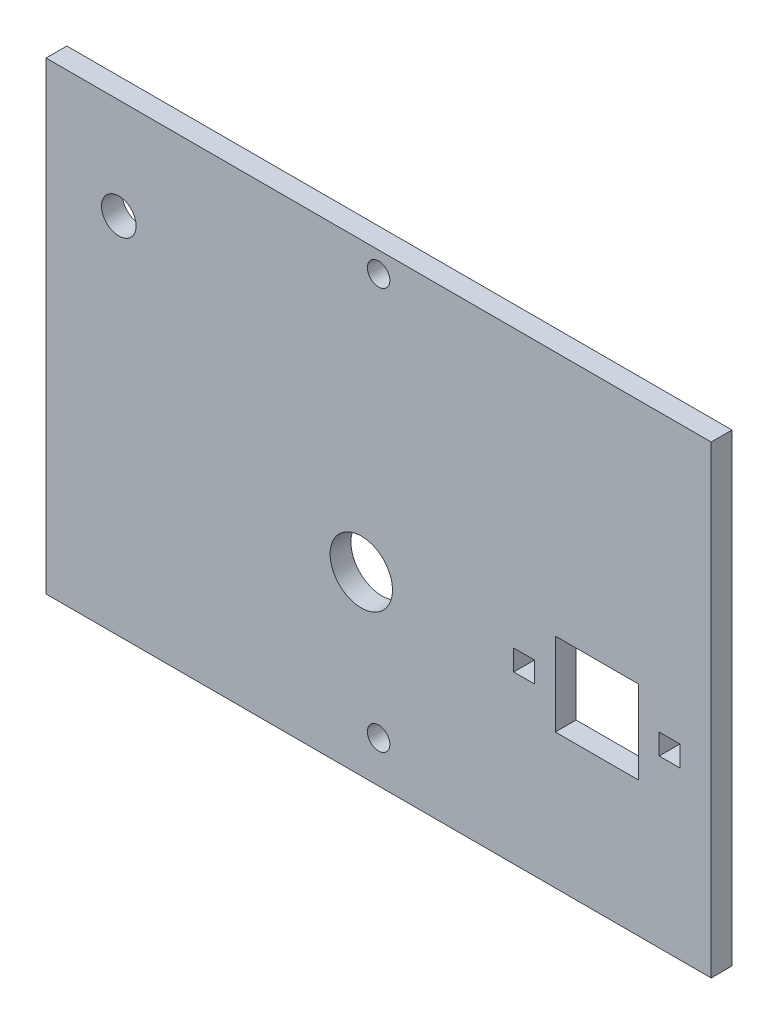
ISO-10303-21;
HEADER;
FILE_DESCRIPTION(('STEP AP214'),'2;1');
FILE_NAME('part.step','',(''),(''),'','','');
FILE_SCHEMA(('AUTOMOTIVE_DESIGN { 1 0 10303 214 1 1 1 1 }'));
ENDSEC;
DATA;
#1=APPLICATION_CONTEXT('core data for automotive mechanical design processes');
#2=APPLICATION_PROTOCOL_DEFINITION('international standard','automotive_design',2000,#1);
#3=PRODUCT_CONTEXT('',#1,'mechanical');
#4=PRODUCT('Part','Part','',(#3));
#5=PRODUCT_RELATED_PRODUCT_CATEGORY('part','',(#4));
#6=PRODUCT_DEFINITION_FORMATION('','',#4);
#7=PRODUCT_DEFINITION_CONTEXT('part definition',#1,'design');
#8=PRODUCT_DEFINITION('design','',#6,#7);
#9=PRODUCT_DEFINITION_SHAPE('','',#8);
#10=(LENGTH_UNIT() NAMED_UNIT(*) SI_UNIT(.MILLI.,.METRE.));
#11=(NAMED_UNIT(*) PLANE_ANGLE_UNIT() SI_UNIT($,.RADIAN.));
#12=(NAMED_UNIT(*) SI_UNIT($,.STERADIAN.) SOLID_ANGLE_UNIT());
#13=UNCERTAINTY_MEASURE_WITH_UNIT(LENGTH_MEASURE(1.E-05),#10,'distance_accuracy_value','');
#14=(GEOMETRIC_REPRESENTATION_CONTEXT(3) GLOBAL_UNCERTAINTY_ASSIGNED_CONTEXT((#13)) GLOBAL_UNIT_ASSIGNED_CONTEXT((#10,
#11,#12)) REPRESENTATION_CONTEXT('',''));
#15=CARTESIAN_POINT('',(0.,0.,0.));
#16=DIRECTION('',(0.,0.,1.));
#17=DIRECTION('',(1.,0.,0.));
#18=AXIS2_PLACEMENT_3D('',#15,#16,#17);
#19=CARTESIAN_POINT('',(48.,-33.5,3.));
#20=DIRECTION('',(-1.,0.,0.));
#21=DIRECTION('',(0.,0.,1.));
#22=AXIS2_PLACEMENT_3D('',#19,#20,#21);
#23=PLANE('',#22);
#24=DIRECTION('',(0.,1.,0.));
#25=VECTOR('',#24,1.);
#26=CARTESIAN_POINT('',(48.,-33.5,0.));
#27=LINE('',#26,#25);
#28=CARTESIAN_POINT('',(48.,-33.5,0.));
#29=VERTEX_POINT('',#28);
#30=CARTESIAN_POINT('',(48.,33.5,0.));
#31=VERTEX_POINT('',#30);
#32=EDGE_CURVE('E324',#29,#31,#27,.T.);
#33=ORIENTED_EDGE('',*,*,#32,.T.);
#34=DIRECTION('',(0.,0.,-1.));
#35=VECTOR('',#34,1.);
#36=CARTESIAN_POINT('',(48.,33.5,3.));
#37=LINE('',#36,#35);
#38=CARTESIAN_POINT('',(48.,33.5,3.));
#39=VERTEX_POINT('',#38);
#40=EDGE_CURVE('E11',#39,#31,#37,.T.);
#41=ORIENTED_EDGE('',*,*,#40,.F.);
#42=DIRECTION('',(0.,1.,0.));
#43=VECTOR('',#42,1.);
#44=CARTESIAN_POINT('',(48.,-33.5,3.));
#45=LINE('',#44,#43);
#46=CARTESIAN_POINT('',(48.,-33.5,3.));
#47=VERTEX_POINT('',#46);
#48=EDGE_CURVE('E309',#47,#39,#45,.T.);
#49=ORIENTED_EDGE('',*,*,#48,.F.);
#50=DIRECTION('',(0.,0.,-1.));
#51=VECTOR('',#50,1.);
#52=CARTESIAN_POINT('',(48.,-33.5,3.));
#53=LINE('',#52,#51);
#54=EDGE_CURVE('E323',#47,#29,#53,.T.);
#55=ORIENTED_EDGE('',*,*,#54,.T.);
#56=EDGE_LOOP('',(#33,#41,#49,#55));
#57=FACE_BOUND('',#56,.T.);
#58=ADVANCED_FACE('F43',(#57),#23,.F.);
#59=CARTESIAN_POINT('',(-48.,33.5,3.));
#60=DIRECTION('',(0.,-1.,0.));
#61=DIRECTION('',(0.,0.,-1.));
#62=AXIS2_PLACEMENT_3D('',#59,#60,#61);
#63=PLANE('',#62);
#64=DIRECTION('',(-1.,0.,0.));
#65=VECTOR('',#64,1.);
#66=CARTESIAN_POINT('',(-48.,33.5,0.));
#67=LINE('',#66,#65);
#68=CARTESIAN_POINT('',(-48.,33.5,0.));
#69=VERTEX_POINT('',#68);
#70=EDGE_CURVE('E328',#31,#69,#67,.T.);
#71=ORIENTED_EDGE('',*,*,#70,.T.);
#72=DIRECTION('',(0.,0.,-1.));
#73=VECTOR('',#72,1.);
#74=CARTESIAN_POINT('',(-48.,33.5,3.));
#75=LINE('',#74,#73);
#76=CARTESIAN_POINT('',(-48.,33.5,3.));
#77=VERTEX_POINT('',#76);
#78=EDGE_CURVE('E51',#77,#69,#75,.T.);
#79=ORIENTED_EDGE('',*,*,#78,.F.);
#80=DIRECTION('',(-1.,0.,0.));
#81=VECTOR('',#80,1.);
#82=CARTESIAN_POINT('',(-48.,33.5,3.));
#83=LINE('',#82,#81);
#84=EDGE_CURVE('E313',#39,#77,#83,.T.);
#85=ORIENTED_EDGE('',*,*,#84,.F.);
#86=ORIENTED_EDGE('',*,*,#40,.T.);
#87=EDGE_LOOP('',(#71,#79,#85,#86));
#88=FACE_BOUND('',#87,.T.);
#89=ADVANCED_FACE('F364',(#88),#63,.F.);
#90=CARTESIAN_POINT('',(-48.,-33.5,3.));
#91=DIRECTION('',(1.,0.,0.));
#92=DIRECTION('',(0.,0.,-1.));
#93=AXIS2_PLACEMENT_3D('',#90,#91,#92);
#94=PLANE('',#93);
#95=DIRECTION('',(0.,-1.,0.));
#96=VECTOR('',#95,1.);
#97=CARTESIAN_POINT('',(-48.,-33.5,0.));
#98=LINE('',#97,#96);
#99=CARTESIAN_POINT('',(-48.,-33.5,0.));
#100=VERTEX_POINT('',#99);
#101=EDGE_CURVE('E332',#69,#100,#98,.T.);
#102=ORIENTED_EDGE('',*,*,#101,.T.);
#103=DIRECTION('',(0.,0.,-1.));
#104=VECTOR('',#103,1.);
#105=CARTESIAN_POINT('',(-48.,-33.5,3.));
#106=LINE('',#105,#104);
#107=CARTESIAN_POINT('',(-48.,-33.5,3.));
#108=VERTEX_POINT('',#107);
#109=EDGE_CURVE('E340',#108,#100,#106,.T.);
#110=ORIENTED_EDGE('',*,*,#109,.F.);
#111=DIRECTION('',(0.,-1.,0.));
#112=VECTOR('',#111,1.);
#113=CARTESIAN_POINT('',(-48.,-33.5,3.));
#114=LINE('',#113,#112);
#115=EDGE_CURVE('E317',#77,#108,#114,.T.);
#116=ORIENTED_EDGE('',*,*,#115,.F.);
#117=ORIENTED_EDGE('',*,*,#78,.T.);
#118=EDGE_LOOP('',(#102,#110,#116,#117));
#119=FACE_BOUND('',#118,.T.);
#120=ADVANCED_FACE('F349',(#119),#94,.F.);
#121=CARTESIAN_POINT('',(-48.,-33.5,3.));
#122=DIRECTION('',(0.,1.,0.));
#123=DIRECTION('',(0.,0.,1.));
#124=AXIS2_PLACEMENT_3D('',#121,#122,#123);
#125=PLANE('',#124);
#126=DIRECTION('',(1.,0.,0.));
#127=VECTOR('',#126,1.);
#128=CARTESIAN_POINT('',(-48.,-33.5,0.));
#129=LINE('',#128,#127);
#130=EDGE_CURVE('E314',#100,#29,#129,.T.);
#131=ORIENTED_EDGE('',*,*,#130,.T.);
#132=ORIENTED_EDGE('',*,*,#54,.F.);
#133=DIRECTION('',(1.,0.,0.));
#134=VECTOR('',#133,1.);
#135=CARTESIAN_POINT('',(-48.,-33.5,3.));
#136=LINE('',#135,#134);
#137=EDGE_CURVE('E320',#108,#47,#136,.T.);
#138=ORIENTED_EDGE('',*,*,#137,.F.);
#139=ORIENTED_EDGE('',*,*,#109,.T.);
#140=EDGE_LOOP('',(#131,#132,#138,#139));
#141=FACE_BOUND('',#140,.T.);
#142=ADVANCED_FACE('F357',(#141),#125,.F.);
#143=CARTESIAN_POINT('',(0.,0.,3.));
#144=DIRECTION('',(0.,0.,-1.));
#145=DIRECTION('',(-1.,0.,0.));
#146=AXIS2_PLACEMENT_3D('',#143,#144,#145);
#147=PLANE('',#146);
#148=CARTESIAN_POINT('',(-37.5,19.,3.));
#149=DIRECTION('',(0.,0.,1.));
#150=DIRECTION('',(1.,0.,0.));
#151=AXIS2_PLACEMENT_3D('',#148,#149,#150);
#152=CIRCLE('',#151,2.5);
#153=CARTESIAN_POINT('',(-35.,19.,3.));
#154=VERTEX_POINT('',#153);
#155=EDGE_CURVE('E329',#154,#154,#152,.T.);
#156=ORIENTED_EDGE('',*,*,#155,.F.);
#157=EDGE_LOOP('',(#156));
#158=FACE_BOUND('',#157,.T.);
#159=DIRECTION('',(0.,1.,0.));
#160=VECTOR('',#159,1.);
#161=CARTESIAN_POINT('',(43.5,-9.50000000000001,3.));
#162=LINE('',#161,#160);
#163=CARTESIAN_POINT('',(43.5,-9.50000000000001,3.));
#164=VERTEX_POINT('',#163);
#165=CARTESIAN_POINT('',(43.5,-6.50000000000001,3.));
#166=VERTEX_POINT('',#165);
#167=EDGE_CURVE('E219',#164,#166,#162,.T.);
#168=ORIENTED_EDGE('',*,*,#167,.F.);
#169=DIRECTION('',(1.,0.,0.));
#170=VECTOR('',#169,1.);
#171=CARTESIAN_POINT('',(40.5,-9.50000000000001,3.));
#172=LINE('',#171,#170);
#173=CARTESIAN_POINT('',(40.5,-9.50000000000001,3.));
#174=VERTEX_POINT('',#173);
#175=EDGE_CURVE('E213',#174,#164,#172,.T.);
#176=ORIENTED_EDGE('',*,*,#175,.F.);
#177=DIRECTION('',(0.,-1.,0.));
#178=VECTOR('',#177,1.);
#179=CARTESIAN_POINT('',(40.5,-9.50000000000001,3.));
#180=LINE('',#179,#178);
#181=CARTESIAN_POINT('',(40.5,-6.50000000000001,3.));
#182=VERTEX_POINT('',#181);
#183=EDGE_CURVE('E234',#182,#174,#180,.T.);
#184=ORIENTED_EDGE('',*,*,#183,.F.);
#185=DIRECTION('',(-1.,0.,0.));
#186=VECTOR('',#185,1.);
#187=CARTESIAN_POINT('',(40.5,-6.50000000000001,3.));
#188=LINE('',#187,#186);
#189=EDGE_CURVE('E237',#166,#182,#188,.T.);
#190=ORIENTED_EDGE('',*,*,#189,.F.);
#191=EDGE_LOOP('',(#168,#176,#184,#190));
#192=FACE_BOUND('',#191,.T.);
#193=DIRECTION('',(0.,1.,0.));
#194=VECTOR('',#193,1.);
#195=CARTESIAN_POINT('',(22.5,-9.50000000000001,3.));
#196=LINE('',#195,#194);
#197=CARTESIAN_POINT('',(22.5,-9.50000000000001,3.));
#198=VERTEX_POINT('',#197);
#199=CARTESIAN_POINT('',(22.5,-6.50000000000001,3.));
#200=VERTEX_POINT('',#199);
#201=EDGE_CURVE('E175',#198,#200,#196,.T.);
#202=ORIENTED_EDGE('',*,*,#201,.F.);
#203=DIRECTION('',(1.,0.,0.));
#204=VECTOR('',#203,1.);
#205=CARTESIAN_POINT('',(19.5,-9.50000000000001,3.));
#206=LINE('',#205,#204);
#207=CARTESIAN_POINT('',(19.5,-9.50000000000001,3.));
#208=VERTEX_POINT('',#207);
#209=EDGE_CURVE('E190',#208,#198,#206,.T.);
#210=ORIENTED_EDGE('',*,*,#209,.F.);
#211=DIRECTION('',(0.,-1.,0.));
#212=VECTOR('',#211,1.);
#213=CARTESIAN_POINT('',(19.5,-9.50000000000001,3.));
#214=LINE('',#213,#212);
#215=CARTESIAN_POINT('',(19.5,-6.50000000000001,3.));
#216=VERTEX_POINT('',#215);
#217=EDGE_CURVE('E161',#216,#208,#214,.T.);
#218=ORIENTED_EDGE('',*,*,#217,.F.);
#219=DIRECTION('',(-1.,0.,0.));
#220=VECTOR('',#219,1.);
#221=CARTESIAN_POINT('',(19.5,-6.50000000000001,3.));
#222=LINE('',#221,#220);
#223=EDGE_CURVE('E195',#200,#216,#222,.T.);
#224=ORIENTED_EDGE('',*,*,#223,.F.);
#225=EDGE_LOOP('',(#202,#210,#218,#224));
#226=FACE_BOUND('',#225,.T.);
#227=CARTESIAN_POINT('',(-2.50000000000002,-8.00000000000001,3.));
#228=DIRECTION('',(0.,0.,1.));
#229=DIRECTION('',(1.,0.,0.));
#230=AXIS2_PLACEMENT_3D('',#227,#228,#229);
#231=CIRCLE('',#230,4.5);
#232=CARTESIAN_POINT('',(1.99999999999998,-8.00000000000001,3.));
#233=VERTEX_POINT('',#232);
#234=EDGE_CURVE('E263',#233,#233,#231,.T.);
#235=ORIENTED_EDGE('',*,*,#234,.F.);
#236=EDGE_LOOP('',(#235));
#237=FACE_BOUND('',#236,.T.);
#238=DIRECTION('',(0.,1.,0.));
#239=VECTOR('',#238,1.);
#240=CARTESIAN_POINT('',(37.5,-2.00000000000001,3.));
#241=LINE('',#240,#239);
#242=CARTESIAN_POINT('',(37.5,-14.,3.));
#243=VERTEX_POINT('',#242);
#244=CARTESIAN_POINT('',(37.5,-2.00000000000001,3.));
#245=VERTEX_POINT('',#244);
#246=EDGE_CURVE('E287',#243,#245,#241,.T.);
#247=ORIENTED_EDGE('',*,*,#246,.F.);
#248=DIRECTION('',(1.,0.,0.));
#249=VECTOR('',#248,1.);
#250=CARTESIAN_POINT('',(25.5,-14.,3.));
#251=LINE('',#250,#249);
#252=CARTESIAN_POINT('',(25.5,-14.,3.));
#253=VERTEX_POINT('',#252);
#254=EDGE_CURVE('E281',#253,#243,#251,.T.);
#255=ORIENTED_EDGE('',*,*,#254,.F.);
#256=DIRECTION('',(0.,-1.,0.));
#257=VECTOR('',#256,1.);
#258=CARTESIAN_POINT('',(25.5,-2.00000000000001,3.));
#259=LINE('',#258,#257);
#260=CARTESIAN_POINT('',(25.5,-2.00000000000001,3.));
#261=VERTEX_POINT('',#260);
#262=EDGE_CURVE('E300',#261,#253,#259,.T.);
#263=ORIENTED_EDGE('',*,*,#262,.F.);
#264=DIRECTION('',(-1.,0.,0.));
#265=VECTOR('',#264,1.);
#266=CARTESIAN_POINT('',(25.5,-2.00000000000001,3.));
#267=LINE('',#266,#265);
#268=EDGE_CURVE('E304',#245,#261,#267,.T.);
#269=ORIENTED_EDGE('',*,*,#268,.F.);
#270=EDGE_LOOP('',(#247,#255,#263,#269));
#271=FACE_BOUND('',#270,.T.);
#272=CARTESIAN_POINT('',(0.,30.5,3.));
#273=DIRECTION('',(0.,0.,1.));
#274=DIRECTION('',(1.,0.,0.));
#275=AXIS2_PLACEMENT_3D('',#272,#273,#274);
#276=CIRCLE('',#275,1.625);
#277=CARTESIAN_POINT('',(1.62499999999996,30.5,3.));
#278=VERTEX_POINT('',#277);
#279=EDGE_CURVE('E247',#278,#278,#276,.T.);
#280=ORIENTED_EDGE('',*,*,#279,.F.);
#281=EDGE_LOOP('',(#280));
#282=FACE_BOUND('',#281,.T.);
#283=CARTESIAN_POINT('',(0.,-27.5000000000004,3.));
#284=DIRECTION('',(0.,0.,1.));
#285=DIRECTION('',(1.,0.,0.));
#286=AXIS2_PLACEMENT_3D('',#283,#284,#285);
#287=CIRCLE('',#286,1.625);
#288=CARTESIAN_POINT('',(1.625,-27.5000000000004,3.));
#289=VERTEX_POINT('',#288);
#290=EDGE_CURVE('E189',#289,#289,#287,.T.);
#291=ORIENTED_EDGE('',*,*,#290,.F.);
#292=EDGE_LOOP('',(#291));
#293=FACE_BOUND('',#292,.T.);
#294=ORIENTED_EDGE('',*,*,#48,.T.);
#295=ORIENTED_EDGE('',*,*,#84,.T.);
#296=ORIENTED_EDGE('',*,*,#115,.T.);
#297=ORIENTED_EDGE('',*,*,#137,.T.);
#298=EDGE_LOOP('',(#294,#295,#296,#297));
#299=FACE_BOUND('',#298,.T.);
#300=ADVANCED_FACE('F363',(#158,#192,#226,#237,#271,#282,#293,#299),#147,.F.);
#301=CARTESIAN_POINT('',(0.,0.,0.));
#302=DIRECTION('',(0.,0.,-1.));
#303=DIRECTION('',(-1.,0.,0.));
#304=AXIS2_PLACEMENT_3D('',#301,#302,#303);
#305=PLANE('',#304);
#306=CARTESIAN_POINT('',(-37.5,19.,0.));
#307=DIRECTION('',(0.,0.,1.));
#308=DIRECTION('',(1.,0.,0.));
#309=AXIS2_PLACEMENT_3D('',#306,#307,#308);
#310=CIRCLE('',#309,2.5);
#311=CARTESIAN_POINT('',(-35.,19.,0.));
#312=VERTEX_POINT('',#311);
#313=EDGE_CURVE('E262',#312,#312,#310,.T.);
#314=ORIENTED_EDGE('',*,*,#313,.T.);
#315=EDGE_LOOP('',(#314));
#316=FACE_BOUND('',#315,.T.);
#317=DIRECTION('',(1.,0.,0.));
#318=VECTOR('',#317,1.);
#319=CARTESIAN_POINT('',(40.5,-9.50000000000001,0.));
#320=LINE('',#319,#318);
#321=CARTESIAN_POINT('',(40.5,-9.50000000000001,0.));
#322=VERTEX_POINT('',#321);
#323=CARTESIAN_POINT('',(43.5,-9.50000000000001,0.));
#324=VERTEX_POINT('',#323);
#325=EDGE_CURVE('E214',#322,#324,#320,.T.);
#326=ORIENTED_EDGE('',*,*,#325,.T.);
#327=DIRECTION('',(0.,1.,0.));
#328=VECTOR('',#327,1.);
#329=CARTESIAN_POINT('',(43.5,-9.50000000000001,0.));
#330=LINE('',#329,#328);
#331=CARTESIAN_POINT('',(43.5,-6.50000000000001,0.));
#332=VERTEX_POINT('',#331);
#333=EDGE_CURVE('E227',#324,#332,#330,.T.);
#334=ORIENTED_EDGE('',*,*,#333,.T.);
#335=DIRECTION('',(-1.,0.,0.));
#336=VECTOR('',#335,1.);
#337=CARTESIAN_POINT('',(40.5,-6.50000000000001,0.));
#338=LINE('',#337,#336);
#339=CARTESIAN_POINT('',(40.5,-6.50000000000001,0.));
#340=VERTEX_POINT('',#339);
#341=EDGE_CURVE('E223',#332,#340,#338,.T.);
#342=ORIENTED_EDGE('',*,*,#341,.T.);
#343=DIRECTION('',(0.,-1.,0.));
#344=VECTOR('',#343,1.);
#345=CARTESIAN_POINT('',(40.5,-9.50000000000001,0.));
#346=LINE('',#345,#344);
#347=EDGE_CURVE('E218',#340,#322,#346,.T.);
#348=ORIENTED_EDGE('',*,*,#347,.T.);
#349=EDGE_LOOP('',(#326,#334,#342,#348));
#350=FACE_BOUND('',#349,.T.);
#351=DIRECTION('',(1.,0.,0.));
#352=VECTOR('',#351,1.);
#353=CARTESIAN_POINT('',(19.5,-9.50000000000001,0.));
#354=LINE('',#353,#352);
#355=CARTESIAN_POINT('',(19.5,-9.50000000000001,0.));
#356=VERTEX_POINT('',#355);
#357=CARTESIAN_POINT('',(22.5,-9.50000000000001,0.));
#358=VERTEX_POINT('',#357);
#359=EDGE_CURVE('E169',#356,#358,#354,.T.);
#360=ORIENTED_EDGE('',*,*,#359,.T.);
#361=DIRECTION('',(0.,1.,0.));
#362=VECTOR('',#361,1.);
#363=CARTESIAN_POINT('',(22.5,-9.50000000000001,0.));
#364=LINE('',#363,#362);
#365=CARTESIAN_POINT('',(22.5,-6.50000000000001,0.));
#366=VERTEX_POINT('',#365);
#367=EDGE_CURVE('E183',#358,#366,#364,.T.);
#368=ORIENTED_EDGE('',*,*,#367,.T.);
#369=DIRECTION('',(-1.,0.,0.));
#370=VECTOR('',#369,1.);
#371=CARTESIAN_POINT('',(19.5,-6.50000000000001,0.));
#372=LINE('',#371,#370);
#373=CARTESIAN_POINT('',(19.5,-6.50000000000001,0.));
#374=VERTEX_POINT('',#373);
#375=EDGE_CURVE('E179',#366,#374,#372,.T.);
#376=ORIENTED_EDGE('',*,*,#375,.T.);
#377=DIRECTION('',(0.,-1.,0.));
#378=VECTOR('',#377,1.);
#379=CARTESIAN_POINT('',(19.5,-9.50000000000001,0.));
#380=LINE('',#379,#378);
#381=EDGE_CURVE('E158',#374,#356,#380,.T.);
#382=ORIENTED_EDGE('',*,*,#381,.T.);
#383=EDGE_LOOP('',(#360,#368,#376,#382));
#384=FACE_BOUND('',#383,.T.);
#385=CARTESIAN_POINT('',(-2.50000000000002,-8.00000000000001,0.));
#386=DIRECTION('',(0.,0.,1.));
#387=DIRECTION('',(1.,0.,0.));
#388=AXIS2_PLACEMENT_3D('',#385,#386,#387);
#389=CIRCLE('',#388,4.5);
#390=CARTESIAN_POINT('',(1.99999999999998,-8.00000000000001,0.));
#391=VERTEX_POINT('',#390);
#392=EDGE_CURVE('E258',#391,#391,#389,.T.);
#393=ORIENTED_EDGE('',*,*,#392,.T.);
#394=EDGE_LOOP('',(#393));
#395=FACE_BOUND('',#394,.T.);
#396=DIRECTION('',(1.,0.,0.));
#397=VECTOR('',#396,1.);
#398=CARTESIAN_POINT('',(25.5,-14.,0.));
#399=LINE('',#398,#397);
#400=CARTESIAN_POINT('',(25.5,-14.,0.));
#401=VERTEX_POINT('',#400);
#402=CARTESIAN_POINT('',(37.5,-14.,0.));
#403=VERTEX_POINT('',#402);
#404=EDGE_CURVE('E282',#401,#403,#399,.T.);
#405=ORIENTED_EDGE('',*,*,#404,.T.);
#406=DIRECTION('',(0.,1.,0.));
#407=VECTOR('',#406,1.);
#408=CARTESIAN_POINT('',(37.5,-2.00000000000001,0.));
#409=LINE('',#408,#407);
#410=CARTESIAN_POINT('',(37.5,-2.00000000000001,0.));
#411=VERTEX_POINT('',#410);
#412=EDGE_CURVE('E267',#403,#411,#409,.T.);
#413=ORIENTED_EDGE('',*,*,#412,.T.);
#414=DIRECTION('',(-1.,0.,0.));
#415=VECTOR('',#414,1.);
#416=CARTESIAN_POINT('',(25.5,-2.00000000000001,0.));
#417=LINE('',#416,#415);
#418=CARTESIAN_POINT('',(25.5,-2.00000000000001,0.));
#419=VERTEX_POINT('',#418);
#420=EDGE_CURVE('E291',#411,#419,#417,.T.);
#421=ORIENTED_EDGE('',*,*,#420,.T.);
#422=DIRECTION('',(0.,-1.,0.));
#423=VECTOR('',#422,1.);
#424=CARTESIAN_POINT('',(25.5,-2.00000000000001,0.));
#425=LINE('',#424,#423);
#426=EDGE_CURVE('E286',#419,#401,#425,.T.);
#427=ORIENTED_EDGE('',*,*,#426,.T.);
#428=EDGE_LOOP('',(#405,#413,#421,#427));
#429=FACE_BOUND('',#428,.T.);
#430=CARTESIAN_POINT('',(0.,30.5,0.));
#431=DIRECTION('',(0.,0.,1.));
#432=DIRECTION('',(1.,0.,0.));
#433=AXIS2_PLACEMENT_3D('',#430,#431,#432);
#434=CIRCLE('',#433,1.625);
#435=CARTESIAN_POINT('',(1.62499999999996,30.5,0.));
#436=VERTEX_POINT('',#435);
#437=EDGE_CURVE('E242',#436,#436,#434,.T.);
#438=ORIENTED_EDGE('',*,*,#437,.T.);
#439=EDGE_LOOP('',(#438));
#440=FACE_BOUND('',#439,.T.);
#441=CARTESIAN_POINT('',(0.,-27.5000000000004,0.));
#442=DIRECTION('',(0.,0.,1.));
#443=DIRECTION('',(1.,0.,0.));
#444=AXIS2_PLACEMENT_3D('',#441,#442,#443);
#445=CIRCLE('',#444,1.625);
#446=CARTESIAN_POINT('',(1.625,-27.5000000000004,0.));
#447=VERTEX_POINT('',#446);
#448=EDGE_CURVE('E251',#447,#447,#445,.T.);
#449=ORIENTED_EDGE('',*,*,#448,.T.);
#450=EDGE_LOOP('',(#449));
#451=FACE_BOUND('',#450,.T.);
#452=ORIENTED_EDGE('',*,*,#32,.F.);
#453=ORIENTED_EDGE('',*,*,#130,.F.);
#454=ORIENTED_EDGE('',*,*,#101,.F.);
#455=ORIENTED_EDGE('',*,*,#70,.F.);
#456=EDGE_LOOP('',(#452,#453,#454,#455));
#457=FACE_BOUND('',#456,.T.);
#458=ADVANCED_FACE('F177',(#316,#350,#384,#395,#429,#440,#451,#457),#305,.T.);
#459=CARTESIAN_POINT('',(0.,-27.5000000000004,3.));
#460=DIRECTION('',(0.,0.,-1.));
#461=DIRECTION('',(-1.,0.,0.));
#462=AXIS2_PLACEMENT_3D('',#459,#460,#461);
#463=CYLINDRICAL_SURFACE('',#462,1.625);
#464=ORIENTED_EDGE('',*,*,#290,.T.);
#465=EDGE_LOOP('',(#464));
#466=FACE_BOUND('',#465,.T.);
#467=ORIENTED_EDGE('',*,*,#448,.F.);
#468=EDGE_LOOP('',(#467));
#469=FACE_BOUND('',#468,.T.);
#470=ADVANCED_FACE('F376',(#466,#469),#463,.F.);
#471=CARTESIAN_POINT('',(0.,30.5,3.));
#472=DIRECTION('',(0.,0.,-1.));
#473=DIRECTION('',(-1.,0.,0.));
#474=AXIS2_PLACEMENT_3D('',#471,#472,#473);
#475=CYLINDRICAL_SURFACE('',#474,1.625);
#476=ORIENTED_EDGE('',*,*,#279,.T.);
#477=EDGE_LOOP('',(#476));
#478=FACE_BOUND('',#477,.T.);
#479=ORIENTED_EDGE('',*,*,#437,.F.);
#480=EDGE_LOOP('',(#479));
#481=FACE_BOUND('',#480,.T.);
#482=ADVANCED_FACE('F397',(#478,#481),#475,.F.);
#483=CARTESIAN_POINT('',(37.5,-2.00000000000001,3.));
#484=DIRECTION('',(-1.,0.,0.));
#485=DIRECTION('',(0.,0.,1.));
#486=AXIS2_PLACEMENT_3D('',#483,#484,#485);
#487=PLANE('',#486);
#488=ORIENTED_EDGE('',*,*,#412,.F.);
#489=DIRECTION('',(0.,0.,-1.));
#490=VECTOR('',#489,1.);
#491=CARTESIAN_POINT('',(37.5,-14.,3.));
#492=LINE('',#491,#490);
#493=EDGE_CURVE('E277',#243,#403,#492,.T.);
#494=ORIENTED_EDGE('',*,*,#493,.F.);
#495=ORIENTED_EDGE('',*,*,#246,.T.);
#496=DIRECTION('',(0.,0.,-1.));
#497=VECTOR('',#496,1.);
#498=CARTESIAN_POINT('',(37.5,-2.00000000000001,3.));
#499=LINE('',#498,#497);
#500=EDGE_CURVE('E246',#245,#411,#499,.T.);
#501=ORIENTED_EDGE('',*,*,#500,.T.);
#502=EDGE_LOOP('',(#488,#494,#495,#501));
#503=FACE_BOUND('',#502,.T.);
#504=ADVANCED_FACE('F393',(#503),#487,.T.);
#505=CARTESIAN_POINT('',(25.5,-2.00000000000001,3.));
#506=DIRECTION('',(0.,-1.,0.));
#507=DIRECTION('',(0.,0.,-1.));
#508=AXIS2_PLACEMENT_3D('',#505,#506,#507);
#509=PLANE('',#508);
#510=ORIENTED_EDGE('',*,*,#420,.F.);
#511=ORIENTED_EDGE('',*,*,#500,.F.);
#512=ORIENTED_EDGE('',*,*,#268,.T.);
#513=DIRECTION('',(0.,0.,-1.));
#514=VECTOR('',#513,1.);
#515=CARTESIAN_POINT('',(25.5,-2.00000000000001,3.));
#516=LINE('',#515,#514);
#517=EDGE_CURVE('E271',#261,#419,#516,.T.);
#518=ORIENTED_EDGE('',*,*,#517,.T.);
#519=EDGE_LOOP('',(#510,#511,#512,#518));
#520=FACE_BOUND('',#519,.T.);
#521=ADVANCED_FACE('F389',(#520),#509,.T.);
#522=CARTESIAN_POINT('',(25.5,-2.00000000000001,3.));
#523=DIRECTION('',(1.,0.,0.));
#524=DIRECTION('',(0.,0.,-1.));
#525=AXIS2_PLACEMENT_3D('',#522,#523,#524);
#526=PLANE('',#525);
#527=ORIENTED_EDGE('',*,*,#426,.F.);
#528=ORIENTED_EDGE('',*,*,#517,.F.);
#529=ORIENTED_EDGE('',*,*,#262,.T.);
#530=DIRECTION('',(0.,0.,-1.));
#531=VECTOR('',#530,1.);
#532=CARTESIAN_POINT('',(25.5,-14.,3.));
#533=LINE('',#532,#531);
#534=EDGE_CURVE('E274',#253,#401,#533,.T.);
#535=ORIENTED_EDGE('',*,*,#534,.T.);
#536=EDGE_LOOP('',(#527,#528,#529,#535));
#537=FACE_BOUND('',#536,.T.);
#538=ADVANCED_FACE('F385',(#537),#526,.T.);
#539=CARTESIAN_POINT('',(25.5,-14.,3.));
#540=DIRECTION('',(0.,1.,0.));
#541=DIRECTION('',(0.,0.,1.));
#542=AXIS2_PLACEMENT_3D('',#539,#540,#541);
#543=PLANE('',#542);
#544=ORIENTED_EDGE('',*,*,#404,.F.);
#545=ORIENTED_EDGE('',*,*,#534,.F.);
#546=ORIENTED_EDGE('',*,*,#254,.T.);
#547=ORIENTED_EDGE('',*,*,#493,.T.);
#548=EDGE_LOOP('',(#544,#545,#546,#547));
#549=FACE_BOUND('',#548,.T.);
#550=ADVANCED_FACE('F381',(#549),#543,.T.);
#551=CARTESIAN_POINT('',(-2.50000000000002,-8.00000000000001,3.));
#552=DIRECTION('',(0.,0.,-1.));
#553=DIRECTION('',(-1.,0.,0.));
#554=AXIS2_PLACEMENT_3D('',#551,#552,#553);
#555=CYLINDRICAL_SURFACE('',#554,4.5);
#556=ORIENTED_EDGE('',*,*,#234,.T.);
#557=EDGE_LOOP('',(#556));
#558=FACE_BOUND('',#557,.T.);
#559=ORIENTED_EDGE('',*,*,#392,.F.);
#560=EDGE_LOOP('',(#559));
#561=FACE_BOUND('',#560,.T.);
#562=ADVANCED_FACE('F384',(#558,#561),#555,.F.);
#563=CARTESIAN_POINT('',(22.5,-9.50000000000001,3.));
#564=DIRECTION('',(-1.,0.,0.));
#565=DIRECTION('',(0.,0.,1.));
#566=AXIS2_PLACEMENT_3D('',#563,#564,#565);
#567=PLANE('',#566);
#568=ORIENTED_EDGE('',*,*,#367,.F.);
#569=DIRECTION('',(0.,0.,-1.));
#570=VECTOR('',#569,1.);
#571=CARTESIAN_POINT('',(22.5,-9.50000000000001,3.));
#572=LINE('',#571,#570);
#573=EDGE_CURVE('E164',#198,#358,#572,.T.);
#574=ORIENTED_EDGE('',*,*,#573,.F.);
#575=ORIENTED_EDGE('',*,*,#201,.T.);
#576=DIRECTION('',(0.,0.,-1.));
#577=VECTOR('',#576,1.);
#578=CARTESIAN_POINT('',(22.5,-6.50000000000001,3.));
#579=LINE('',#578,#577);
#580=EDGE_CURVE('E231',#200,#366,#579,.T.);
#581=ORIENTED_EDGE('',*,*,#580,.T.);
#582=EDGE_LOOP('',(#568,#574,#575,#581));
#583=FACE_BOUND('',#582,.T.);
#584=ADVANCED_FACE('F401',(#583),#567,.T.);
#585=CARTESIAN_POINT('',(19.5,-6.50000000000001,3.));
#586=DIRECTION('',(0.,-1.,0.));
#587=DIRECTION('',(0.,0.,-1.));
#588=AXIS2_PLACEMENT_3D('',#585,#586,#587);
#589=PLANE('',#588);
#590=ORIENTED_EDGE('',*,*,#375,.F.);
#591=ORIENTED_EDGE('',*,*,#580,.F.);
#592=ORIENTED_EDGE('',*,*,#223,.T.);
#593=DIRECTION('',(0.,0.,-1.));
#594=VECTOR('',#593,1.);
#595=CARTESIAN_POINT('',(19.5,-6.50000000000001,3.));
#596=LINE('',#595,#594);
#597=EDGE_CURVE('E165',#216,#374,#596,.T.);
#598=ORIENTED_EDGE('',*,*,#597,.T.);
#599=EDGE_LOOP('',(#590,#591,#592,#598));
#600=FACE_BOUND('',#599,.T.);
#601=ADVANCED_FACE('F429',(#600),#589,.T.);
#602=CARTESIAN_POINT('',(19.5,-9.50000000000001,3.));
#603=DIRECTION('',(1.,0.,0.));
#604=DIRECTION('',(0.,0.,-1.));
#605=AXIS2_PLACEMENT_3D('',#602,#603,#604);
#606=PLANE('',#605);
#607=ORIENTED_EDGE('',*,*,#381,.F.);
#608=ORIENTED_EDGE('',*,*,#597,.F.);
#609=ORIENTED_EDGE('',*,*,#217,.T.);
#610=DIRECTION('',(0.,0.,-1.));
#611=VECTOR('',#610,1.);
#612=CARTESIAN_POINT('',(19.5,-9.50000000000001,3.));
#613=LINE('',#612,#611);
#614=EDGE_CURVE('E66',#208,#356,#613,.T.);
#615=ORIENTED_EDGE('',*,*,#614,.T.);
#616=EDGE_LOOP('',(#607,#608,#609,#615));
#617=FACE_BOUND('',#616,.T.);
#618=ADVANCED_FACE('F155',(#617),#606,.T.);
#619=CARTESIAN_POINT('',(19.5,-9.50000000000001,3.));
#620=DIRECTION('',(0.,1.,0.));
#621=DIRECTION('',(0.,0.,1.));
#622=AXIS2_PLACEMENT_3D('',#619,#620,#621);
#623=PLANE('',#622);
#624=ORIENTED_EDGE('',*,*,#359,.F.);
#625=ORIENTED_EDGE('',*,*,#614,.F.);
#626=ORIENTED_EDGE('',*,*,#209,.T.);
#627=ORIENTED_EDGE('',*,*,#573,.T.);
#628=EDGE_LOOP('',(#624,#625,#626,#627));
#629=FACE_BOUND('',#628,.T.);
#630=ADVANCED_FACE('F170',(#629),#623,.T.);
#631=CARTESIAN_POINT('',(43.5,-9.50000000000001,3.));
#632=DIRECTION('',(-1.,0.,0.));
#633=DIRECTION('',(0.,0.,1.));
#634=AXIS2_PLACEMENT_3D('',#631,#632,#633);
#635=PLANE('',#634);
#636=ORIENTED_EDGE('',*,*,#333,.F.);
#637=DIRECTION('',(0.,0.,-1.));
#638=VECTOR('',#637,1.);
#639=CARTESIAN_POINT('',(43.5,-9.50000000000001,3.));
#640=LINE('',#639,#638);
#641=EDGE_CURVE('E209',#164,#324,#640,.T.);
#642=ORIENTED_EDGE('',*,*,#641,.F.);
#643=ORIENTED_EDGE('',*,*,#167,.T.);
#644=DIRECTION('',(0.,0.,-1.));
#645=VECTOR('',#644,1.);
#646=CARTESIAN_POINT('',(43.5,-6.50000000000001,3.));
#647=LINE('',#646,#645);
#648=EDGE_CURVE('E200',#166,#332,#647,.T.);
#649=ORIENTED_EDGE('',*,*,#648,.T.);
#650=EDGE_LOOP('',(#636,#642,#643,#649));
#651=FACE_BOUND('',#650,.T.);
#652=ADVANCED_FACE('F420',(#651),#635,.T.);
#653=CARTESIAN_POINT('',(40.5,-6.50000000000001,3.));
#654=DIRECTION('',(0.,-1.,0.));
#655=DIRECTION('',(0.,0.,-1.));
#656=AXIS2_PLACEMENT_3D('',#653,#654,#655);
#657=PLANE('',#656);
#658=ORIENTED_EDGE('',*,*,#341,.F.);
#659=ORIENTED_EDGE('',*,*,#648,.F.);
#660=ORIENTED_EDGE('',*,*,#189,.T.);
#661=DIRECTION('',(0.,0.,-1.));
#662=VECTOR('',#661,1.);
#663=CARTESIAN_POINT('',(40.5,-6.50000000000001,3.));
#664=LINE('',#663,#662);
#665=EDGE_CURVE('E204',#182,#340,#664,.T.);
#666=ORIENTED_EDGE('',*,*,#665,.T.);
#667=EDGE_LOOP('',(#658,#659,#660,#666));
#668=FACE_BOUND('',#667,.T.);
#669=ADVANCED_FACE('F416',(#668),#657,.T.);
#670=CARTESIAN_POINT('',(40.5,-9.50000000000001,3.));
#671=DIRECTION('',(1.,0.,0.));
#672=DIRECTION('',(0.,0.,-1.));
#673=AXIS2_PLACEMENT_3D('',#670,#671,#672);
#674=PLANE('',#673);
#675=ORIENTED_EDGE('',*,*,#347,.F.);
#676=ORIENTED_EDGE('',*,*,#665,.F.);
#677=ORIENTED_EDGE('',*,*,#183,.T.);
#678=DIRECTION('',(0.,0.,-1.));
#679=VECTOR('',#678,1.);
#680=CARTESIAN_POINT('',(40.5,-9.50000000000001,3.));
#681=LINE('',#680,#679);
#682=EDGE_CURVE('E58',#174,#322,#681,.T.);
#683=ORIENTED_EDGE('',*,*,#682,.T.);
#684=EDGE_LOOP('',(#675,#676,#677,#683));
#685=FACE_BOUND('',#684,.T.);
#686=ADVANCED_FACE('F413',(#685),#674,.T.);
#687=CARTESIAN_POINT('',(40.5,-9.50000000000001,3.));
#688=DIRECTION('',(0.,1.,0.));
#689=DIRECTION('',(0.,0.,1.));
#690=AXIS2_PLACEMENT_3D('',#687,#688,#689);
#691=PLANE('',#690);
#692=ORIENTED_EDGE('',*,*,#325,.F.);
#693=ORIENTED_EDGE('',*,*,#682,.F.);
#694=ORIENTED_EDGE('',*,*,#175,.T.);
#695=ORIENTED_EDGE('',*,*,#641,.T.);
#696=EDGE_LOOP('',(#692,#693,#694,#695));
#697=FACE_BOUND('',#696,.T.);
#698=ADVANCED_FACE('F409',(#697),#691,.T.);
#699=CARTESIAN_POINT('',(-37.5,19.,3.));
#700=DIRECTION('',(0.,0.,-1.));
#701=DIRECTION('',(-1.,0.,0.));
#702=AXIS2_PLACEMENT_3D('',#699,#700,#701);
#703=CYLINDRICAL_SURFACE('',#702,2.5);
#704=ORIENTED_EDGE('',*,*,#155,.T.);
#705=EDGE_LOOP('',(#704));
#706=FACE_BOUND('',#705,.T.);
#707=ORIENTED_EDGE('',*,*,#313,.F.);
#708=EDGE_LOOP('',(#707));
#709=FACE_BOUND('',#708,.T.);
#710=ADVANCED_FACE('F412',(#706,#709),#703,.F.);
#711=CLOSED_SHELL('',(#58,#89,#120,#142,#300,#458,#470,#482,#504,#521,#538,#550,#562,#584,#601,
#618,#630,#652,#669,#686,#698,#710));
#712=MANIFOLD_SOLID_BREP('B2',#711);
#713=ADVANCED_BREP_SHAPE_REPRESENTATION('',(#18,#712),#14);
#714=SHAPE_DEFINITION_REPRESENTATION(#9,#713);
ENDSEC;
END-ISO-10303-21;
